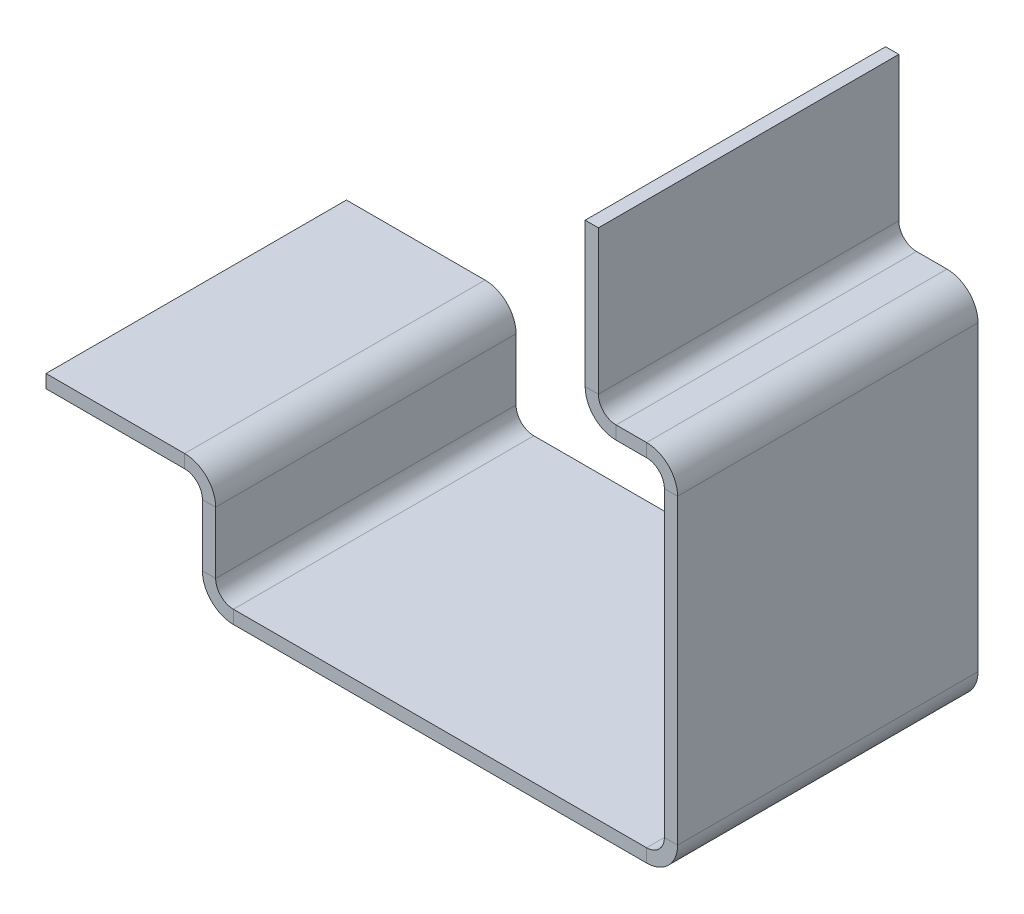
ISO-10303-21;
HEADER;
FILE_DESCRIPTION(('STEP AP214'),'2;1');
FILE_NAME('part.step','',(''),(''),'','','');
FILE_SCHEMA(('AUTOMOTIVE_DESIGN { 1 0 10303 214 1 1 1 1 }'));
ENDSEC;
DATA;
#1=APPLICATION_CONTEXT('core data for automotive mechanical design processes');
#2=APPLICATION_PROTOCOL_DEFINITION('international standard','automotive_design',2000,#1);
#3=PRODUCT_CONTEXT('',#1,'mechanical');
#4=PRODUCT('Part','Part','',(#3));
#5=PRODUCT_RELATED_PRODUCT_CATEGORY('part','',(#4));
#6=PRODUCT_DEFINITION_FORMATION('','',#4);
#7=PRODUCT_DEFINITION_CONTEXT('part definition',#1,'design');
#8=PRODUCT_DEFINITION('design','',#6,#7);
#9=PRODUCT_DEFINITION_SHAPE('','',#8);
#10=(LENGTH_UNIT() NAMED_UNIT(*) SI_UNIT(.MILLI.,.METRE.));
#11=(NAMED_UNIT(*) PLANE_ANGLE_UNIT() SI_UNIT($,.RADIAN.));
#12=(NAMED_UNIT(*) SI_UNIT($,.STERADIAN.) SOLID_ANGLE_UNIT());
#13=UNCERTAINTY_MEASURE_WITH_UNIT(LENGTH_MEASURE(1.E-05),#10,'distance_accuracy_value','');
#14=(GEOMETRIC_REPRESENTATION_CONTEXT(3) GLOBAL_UNCERTAINTY_ASSIGNED_CONTEXT((#13)) GLOBAL_UNIT_ASSIGNED_CONTEXT((#10,
#11,#12)) REPRESENTATION_CONTEXT('',''));
#15=CARTESIAN_POINT('',(0.,0.,0.));
#16=DIRECTION('',(0.,0.,1.));
#17=DIRECTION('',(1.,0.,0.));
#18=AXIS2_PLACEMENT_3D('',#15,#16,#17);
#19=CARTESIAN_POINT('',(81.4,38.12,144.15));
#20=DIRECTION('',(0.,0.,1.));
#21=DIRECTION('',(1.,0.,0.));
#22=AXIS2_PLACEMENT_3D('',#19,#20,#21);
#23=PLANE('',#22);
#24=DIRECTION('',(-1.,0.,0.));
#25=VECTOR('',#24,1.);
#26=CARTESIAN_POINT('',(81.4,38.12,144.15));
#27=LINE('',#26,#25);
#28=CARTESIAN_POINT('',(81.4,38.12,144.15));
#29=VERTEX_POINT('',#28);
#30=CARTESIAN_POINT('',(75.05,38.12,144.15));
#31=VERTEX_POINT('',#30);
#32=EDGE_CURVE('E13',#29,#31,#27,.T.);
#33=ORIENTED_EDGE('',*,*,#32,.F.);
#34=CARTESIAN_POINT('',(66.52,38.12,144.15));
#35=DIRECTION('',(0.,0.,1.));
#36=DIRECTION('',(1.,0.,0.));
#37=AXIS2_PLACEMENT_3D('',#34,#35,#36);
#38=CIRCLE('',#37,14.88);
#39=CARTESIAN_POINT('',(66.52,53.,144.15));
#40=VERTEX_POINT('',#39);
#41=EDGE_CURVE('E515',#40,#29,#38,.F.);
#42=ORIENTED_EDGE('',*,*,#41,.F.);
#43=DIRECTION('',(0.,1.,0.));
#44=VECTOR('',#43,1.);
#45=CARTESIAN_POINT('',(66.52,46.65,144.15));
#46=LINE('',#45,#44);
#47=CARTESIAN_POINT('',(66.52,46.65,144.15));
#48=VERTEX_POINT('',#47);
#49=EDGE_CURVE('E68',#48,#40,#46,.T.);
#50=ORIENTED_EDGE('',*,*,#49,.F.);
#51=CARTESIAN_POINT('',(66.52,38.12,144.15));
#52=DIRECTION('',(0.,0.,1.));
#53=DIRECTION('',(1.,0.,0.));
#54=AXIS2_PLACEMENT_3D('',#51,#52,#53);
#55=CIRCLE('',#54,8.53);
#56=EDGE_CURVE('E532',#48,#31,#55,.F.);
#57=ORIENTED_EDGE('',*,*,#56,.T.);
#58=EDGE_LOOP('',(#33,#42,#50,#57));
#59=FACE_BOUND('',#58,.T.);
#60=ADVANCED_FACE('F59',(#59),#23,.T.);
#61=CARTESIAN_POINT('',(66.52,46.65,144.15));
#62=DIRECTION('',(0.,0.,1.));
#63=DIRECTION('',(1.,0.,0.));
#64=AXIS2_PLACEMENT_3D('',#61,#62,#63);
#65=PLANE('',#64);
#66=DIRECTION('',(0.,-1.,0.));
#67=VECTOR('',#66,1.);
#68=CARTESIAN_POINT('',(81.4,53.,144.15));
#69=LINE('',#68,#67);
#70=CARTESIAN_POINT('',(81.4,8.53,144.15));
#71=VERTEX_POINT('',#70);
#72=EDGE_CURVE('E520',#29,#71,#69,.T.);
#73=ORIENTED_EDGE('',*,*,#72,.F.);
#74=ORIENTED_EDGE('',*,*,#32,.T.);
#75=DIRECTION('',(0.,1.,0.));
#76=VECTOR('',#75,1.);
#77=CARTESIAN_POINT('',(75.05,53.,144.15));
#78=LINE('',#77,#76);
#79=CARTESIAN_POINT('',(75.05,8.53,144.15));
#80=VERTEX_POINT('',#79);
#81=EDGE_CURVE('E535',#31,#80,#78,.F.);
#82=ORIENTED_EDGE('',*,*,#81,.T.);
#83=DIRECTION('',(1.,0.,0.));
#84=VECTOR('',#83,1.);
#85=CARTESIAN_POINT('',(75.05,8.53,144.15));
#86=LINE('',#85,#84);
#87=EDGE_CURVE('E484',#80,#71,#86,.T.);
#88=ORIENTED_EDGE('',*,*,#87,.T.);
#89=EDGE_LOOP('',(#73,#74,#82,#88));
#90=FACE_BOUND('',#89,.T.);
#91=ADVANCED_FACE('F632',(#90),#65,.T.);
#92=CARTESIAN_POINT('',(66.52,53.,0.));
#93=DIRECTION('',(0.,0.,-1.));
#94=DIRECTION('',(-1.,0.,0.));
#95=AXIS2_PLACEMENT_3D('',#92,#93,#94);
#96=PLANE('',#95);
#97=DIRECTION('',(0.,-1.,0.));
#98=VECTOR('',#97,1.);
#99=CARTESIAN_POINT('',(66.52,53.,0.));
#100=LINE('',#99,#98);
#101=CARTESIAN_POINT('',(66.52,53.,0.));
#102=VERTEX_POINT('',#101);
#103=CARTESIAN_POINT('',(66.52,46.65,0.));
#104=VERTEX_POINT('',#103);
#105=EDGE_CURVE('E493',#102,#104,#100,.T.);
#106=ORIENTED_EDGE('',*,*,#105,.F.);
#107=CARTESIAN_POINT('',(66.52,38.12,0.));
#108=DIRECTION('',(0.,0.,1.));
#109=DIRECTION('',(1.,0.,0.));
#110=AXIS2_PLACEMENT_3D('',#107,#108,#109);
#111=CIRCLE('',#110,14.88);
#112=CARTESIAN_POINT('',(81.4,38.12,0.));
#113=VERTEX_POINT('',#112);
#114=EDGE_CURVE('E319',#102,#113,#111,.F.);
#115=ORIENTED_EDGE('',*,*,#114,.T.);
#116=DIRECTION('',(1.,0.,0.));
#117=VECTOR('',#116,1.);
#118=CARTESIAN_POINT('',(75.05,38.12,0.));
#119=LINE('',#118,#117);
#120=CARTESIAN_POINT('',(75.05,38.12,0.));
#121=VERTEX_POINT('',#120);
#122=EDGE_CURVE('E490',#121,#113,#119,.T.);
#123=ORIENTED_EDGE('',*,*,#122,.F.);
#124=CARTESIAN_POINT('',(66.52,38.12,0.));
#125=DIRECTION('',(0.,0.,1.));
#126=DIRECTION('',(1.,0.,0.));
#127=AXIS2_PLACEMENT_3D('',#124,#125,#126);
#128=CIRCLE('',#127,8.53);
#129=EDGE_CURVE('E335',#104,#121,#128,.F.);
#130=ORIENTED_EDGE('',*,*,#129,.F.);
#131=EDGE_LOOP('',(#106,#115,#123,#130));
#132=FACE_BOUND('',#131,.T.);
#133=ADVANCED_FACE('F691',(#132),#96,.T.);
#134=CARTESIAN_POINT('',(75.05,38.12,0.));
#135=DIRECTION('',(0.,0.,-1.));
#136=DIRECTION('',(-1.,0.,0.));
#137=AXIS2_PLACEMENT_3D('',#134,#135,#136);
#138=PLANE('',#137);
#139=DIRECTION('',(1.,0.,0.));
#140=VECTOR('',#139,1.);
#141=CARTESIAN_POINT('',(81.4,53.,0.));
#142=LINE('',#141,#140);
#143=CARTESIAN_POINT('',(0.,53.,0.));
#144=VERTEX_POINT('',#143);
#145=EDGE_CURVE('E323',#144,#102,#142,.T.);
#146=ORIENTED_EDGE('',*,*,#145,.T.);
#147=ORIENTED_EDGE('',*,*,#105,.T.);
#148=DIRECTION('',(1.,0.,0.));
#149=VECTOR('',#148,1.);
#150=CARTESIAN_POINT('',(81.4,46.65,0.));
#151=LINE('',#150,#149);
#152=CARTESIAN_POINT('',(0.,46.65,0.));
#153=VERTEX_POINT('',#152);
#154=EDGE_CURVE('E331',#153,#104,#151,.T.);
#155=ORIENTED_EDGE('',*,*,#154,.F.);
#156=DIRECTION('',(0.,1.,0.));
#157=VECTOR('',#156,1.);
#158=CARTESIAN_POINT('',(0.,46.65,0.));
#159=LINE('',#158,#157);
#160=EDGE_CURVE('E327',#153,#144,#159,.T.);
#161=ORIENTED_EDGE('',*,*,#160,.T.);
#162=EDGE_LOOP('',(#146,#147,#155,#161));
#163=FACE_BOUND('',#162,.T.);
#164=ADVANCED_FACE('F695',(#163),#138,.T.);
#165=CARTESIAN_POINT('',(89.93,0.,144.15));
#166=DIRECTION('',(0.,0.,1.));
#167=DIRECTION('',(1.,0.,0.));
#168=AXIS2_PLACEMENT_3D('',#165,#166,#167);
#169=PLANE('',#168);
#170=DIRECTION('',(0.,-1.,0.));
#171=VECTOR('',#170,1.);
#172=CARTESIAN_POINT('',(89.93,0.,144.15));
#173=LINE('',#172,#171);
#174=CARTESIAN_POINT('',(89.93,0.,144.15));
#175=VERTEX_POINT('',#174);
#176=CARTESIAN_POINT('',(89.93,-6.35,144.15));
#177=VERTEX_POINT('',#176);
#178=EDGE_CURVE('E487',#175,#177,#173,.T.);
#179=ORIENTED_EDGE('',*,*,#178,.F.);
#180=CARTESIAN_POINT('',(89.93,8.53,144.15));
#181=DIRECTION('',(0.,0.,-1.));
#182=DIRECTION('',(-1.,0.,0.));
#183=AXIS2_PLACEMENT_3D('',#180,#181,#182);
#184=CIRCLE('',#183,8.53);
#185=EDGE_CURVE('E620',#71,#175,#184,.F.);
#186=ORIENTED_EDGE('',*,*,#185,.F.);
#187=ORIENTED_EDGE('',*,*,#87,.F.);
#188=CARTESIAN_POINT('',(89.93,8.53,144.15));
#189=DIRECTION('',(0.,0.,1.));
#190=DIRECTION('',(1.,0.,0.));
#191=AXIS2_PLACEMENT_3D('',#188,#189,#190);
#192=CIRCLE('',#191,14.88);
#193=EDGE_CURVE('E539',#80,#177,#192,.T.);
#194=ORIENTED_EDGE('',*,*,#193,.T.);
#195=EDGE_LOOP('',(#179,#186,#187,#194));
#196=FACE_BOUND('',#195,.T.);
#197=ADVANCED_FACE('F639',(#196),#169,.T.);
#198=CARTESIAN_POINT('',(75.05,8.53,144.15));
#199=DIRECTION('',(0.,0.,1.));
#200=DIRECTION('',(1.,0.,0.));
#201=AXIS2_PLACEMENT_3D('',#198,#199,#200);
#202=PLANE('',#201);
#203=DIRECTION('',(1.,0.,0.));
#204=VECTOR('',#203,1.);
#205=CARTESIAN_POINT('',(81.4,0.,144.15));
#206=LINE('',#205,#204);
#207=CARTESIAN_POINT('',(288.17,0.,144.15));
#208=VERTEX_POINT('',#207);
#209=EDGE_CURVE('E616',#175,#208,#206,.T.);
#210=ORIENTED_EDGE('',*,*,#209,.F.);
#211=ORIENTED_EDGE('',*,*,#178,.T.);
#212=DIRECTION('',(1.,0.,0.));
#213=VECTOR('',#212,1.);
#214=CARTESIAN_POINT('',(81.4,-6.35,144.15));
#215=LINE('',#214,#213);
#216=CARTESIAN_POINT('',(288.17,-6.35,144.15));
#217=VERTEX_POINT('',#216);
#218=EDGE_CURVE('E543',#177,#217,#215,.T.);
#219=ORIENTED_EDGE('',*,*,#218,.T.);
#220=DIRECTION('',(0.,1.,0.));
#221=VECTOR('',#220,1.);
#222=CARTESIAN_POINT('',(288.17,-6.35,144.15));
#223=LINE('',#222,#221);
#224=EDGE_CURVE('E472',#217,#208,#223,.T.);
#225=ORIENTED_EDGE('',*,*,#224,.T.);
#226=EDGE_LOOP('',(#210,#211,#219,#225));
#227=FACE_BOUND('',#226,.T.);
#228=ADVANCED_FACE('F648',(#227),#202,.T.);
#229=CARTESIAN_POINT('',(81.4,8.53,0.));
#230=DIRECTION('',(0.,0.,-1.));
#231=DIRECTION('',(-1.,0.,0.));
#232=AXIS2_PLACEMENT_3D('',#229,#230,#231);
#233=PLANE('',#232);
#234=DIRECTION('',(-1.,0.,0.));
#235=VECTOR('',#234,1.);
#236=CARTESIAN_POINT('',(81.4,8.53,0.));
#237=LINE('',#236,#235);
#238=CARTESIAN_POINT('',(81.4,8.53,0.));
#239=VERTEX_POINT('',#238);
#240=CARTESIAN_POINT('',(75.05,8.53,0.));
#241=VERTEX_POINT('',#240);
#242=EDGE_CURVE('E481',#239,#241,#237,.T.);
#243=ORIENTED_EDGE('',*,*,#242,.F.);
#244=CARTESIAN_POINT('',(89.93,8.53,0.));
#245=DIRECTION('',(0.,0.,-1.));
#246=DIRECTION('',(-1.,0.,0.));
#247=AXIS2_PLACEMENT_3D('',#244,#245,#246);
#248=CIRCLE('',#247,8.53);
#249=CARTESIAN_POINT('',(89.93,0.,0.));
#250=VERTEX_POINT('',#249);
#251=EDGE_CURVE('E311',#239,#250,#248,.F.);
#252=ORIENTED_EDGE('',*,*,#251,.T.);
#253=DIRECTION('',(0.,1.,0.));
#254=VECTOR('',#253,1.);
#255=CARTESIAN_POINT('',(89.93,-6.35,0.));
#256=LINE('',#255,#254);
#257=CARTESIAN_POINT('',(89.93,-6.35,0.));
#258=VERTEX_POINT('',#257);
#259=EDGE_CURVE('E478',#258,#250,#256,.T.);
#260=ORIENTED_EDGE('',*,*,#259,.F.);
#261=CARTESIAN_POINT('',(89.93,8.53,0.));
#262=DIRECTION('',(0.,0.,1.));
#263=DIRECTION('',(1.,0.,0.));
#264=AXIS2_PLACEMENT_3D('',#261,#262,#263);
#265=CIRCLE('',#264,14.88);
#266=EDGE_CURVE('E343',#241,#258,#265,.T.);
#267=ORIENTED_EDGE('',*,*,#266,.F.);
#268=EDGE_LOOP('',(#243,#252,#260,#267));
#269=FACE_BOUND('',#268,.T.);
#270=ADVANCED_FACE('F706',(#269),#233,.T.);
#271=CARTESIAN_POINT('',(89.93,-6.35,0.));
#272=DIRECTION('',(0.,0.,-1.));
#273=DIRECTION('',(-1.,0.,0.));
#274=AXIS2_PLACEMENT_3D('',#271,#272,#273);
#275=PLANE('',#274);
#276=DIRECTION('',(0.,-1.,0.));
#277=VECTOR('',#276,1.);
#278=CARTESIAN_POINT('',(81.4,53.,0.));
#279=LINE('',#278,#277);
#280=EDGE_CURVE('E315',#113,#239,#279,.T.);
#281=ORIENTED_EDGE('',*,*,#280,.T.);
#282=ORIENTED_EDGE('',*,*,#242,.T.);
#283=DIRECTION('',(0.,1.,0.));
#284=VECTOR('',#283,1.);
#285=CARTESIAN_POINT('',(75.05,53.,0.));
#286=LINE('',#285,#284);
#287=EDGE_CURVE('E339',#121,#241,#286,.F.);
#288=ORIENTED_EDGE('',*,*,#287,.F.);
#289=ORIENTED_EDGE('',*,*,#122,.T.);
#290=EDGE_LOOP('',(#281,#282,#288,#289));
#291=FACE_BOUND('',#290,.T.);
#292=ADVANCED_FACE('F709',(#291),#275,.T.);
#293=CARTESIAN_POINT('',(296.7,8.53,144.15));
#294=DIRECTION('',(0.,0.,1.));
#295=DIRECTION('',(1.,0.,0.));
#296=AXIS2_PLACEMENT_3D('',#293,#294,#295);
#297=PLANE('',#296);
#298=DIRECTION('',(1.,0.,0.));
#299=VECTOR('',#298,1.);
#300=CARTESIAN_POINT('',(296.7,8.53,144.15));
#301=LINE('',#300,#299);
#302=CARTESIAN_POINT('',(296.7,8.53,144.15));
#303=VERTEX_POINT('',#302);
#304=CARTESIAN_POINT('',(303.05,8.53,144.15));
#305=VERTEX_POINT('',#304);
#306=EDGE_CURVE('E475',#303,#305,#301,.T.);
#307=ORIENTED_EDGE('',*,*,#306,.F.);
#308=CARTESIAN_POINT('',(288.17,8.53,144.15));
#309=DIRECTION('',(0.,0.,-1.));
#310=DIRECTION('',(-1.,0.,0.));
#311=AXIS2_PLACEMENT_3D('',#308,#309,#310);
#312=CIRCLE('',#311,8.53);
#313=EDGE_CURVE('E612',#208,#303,#312,.F.);
#314=ORIENTED_EDGE('',*,*,#313,.F.);
#315=ORIENTED_EDGE('',*,*,#224,.F.);
#316=CARTESIAN_POINT('',(288.17,8.53,144.15));
#317=DIRECTION('',(0.,0.,1.));
#318=DIRECTION('',(1.,0.,0.));
#319=AXIS2_PLACEMENT_3D('',#316,#317,#318);
#320=CIRCLE('',#319,14.88);
#321=EDGE_CURVE('E547',#217,#305,#320,.T.);
#322=ORIENTED_EDGE('',*,*,#321,.T.);
#323=EDGE_LOOP('',(#307,#314,#315,#322));
#324=FACE_BOUND('',#323,.T.);
#325=ADVANCED_FACE('F657',(#324),#297,.T.);
#326=CARTESIAN_POINT('',(288.17,-6.35,144.15));
#327=DIRECTION('',(0.,0.,1.));
#328=DIRECTION('',(1.,0.,0.));
#329=AXIS2_PLACEMENT_3D('',#326,#327,#328);
#330=PLANE('',#329);
#331=DIRECTION('',(0.,1.,0.));
#332=VECTOR('',#331,1.);
#333=CARTESIAN_POINT('',(296.7,0.,144.15));
#334=LINE('',#333,#332);
#335=CARTESIAN_POINT('',(296.7,153.52,144.15));
#336=VERTEX_POINT('',#335);
#337=EDGE_CURVE('E608',#303,#336,#334,.T.);
#338=ORIENTED_EDGE('',*,*,#337,.F.);
#339=ORIENTED_EDGE('',*,*,#306,.T.);
#340=DIRECTION('',(0.,1.,0.));
#341=VECTOR('',#340,1.);
#342=CARTESIAN_POINT('',(303.05,0.,144.15));
#343=LINE('',#342,#341);
#344=CARTESIAN_POINT('',(303.05,153.52,144.15));
#345=VERTEX_POINT('',#344);
#346=EDGE_CURVE('E253',#305,#345,#343,.T.);
#347=ORIENTED_EDGE('',*,*,#346,.T.);
#348=DIRECTION('',(-1.,0.,0.));
#349=VECTOR('',#348,1.);
#350=CARTESIAN_POINT('',(303.05,153.52,144.15));
#351=LINE('',#350,#349);
#352=EDGE_CURVE('E243',#345,#336,#351,.T.);
#353=ORIENTED_EDGE('',*,*,#352,.T.);
#354=EDGE_LOOP('',(#338,#339,#347,#353));
#355=FACE_BOUND('',#354,.T.);
#356=ADVANCED_FACE('F555',(#355),#330,.T.);
#357=CARTESIAN_POINT('',(288.17,0.,0.));
#358=DIRECTION('',(0.,0.,-1.));
#359=DIRECTION('',(-1.,0.,0.));
#360=AXIS2_PLACEMENT_3D('',#357,#358,#359);
#361=PLANE('',#360);
#362=DIRECTION('',(0.,-1.,0.));
#363=VECTOR('',#362,1.);
#364=CARTESIAN_POINT('',(288.17,0.,0.));
#365=LINE('',#364,#363);
#366=CARTESIAN_POINT('',(288.17,0.,0.));
#367=VERTEX_POINT('',#366);
#368=CARTESIAN_POINT('',(288.17,-6.35,0.));
#369=VERTEX_POINT('',#368);
#370=EDGE_CURVE('E469',#367,#369,#365,.T.);
#371=ORIENTED_EDGE('',*,*,#370,.F.);
#372=CARTESIAN_POINT('',(288.17,8.53,0.));
#373=DIRECTION('',(0.,0.,-1.));
#374=DIRECTION('',(-1.,0.,0.));
#375=AXIS2_PLACEMENT_3D('',#372,#373,#374);
#376=CIRCLE('',#375,8.53);
#377=CARTESIAN_POINT('',(296.7,8.53,0.));
#378=VERTEX_POINT('',#377);
#379=EDGE_CURVE('E303',#367,#378,#376,.F.);
#380=ORIENTED_EDGE('',*,*,#379,.T.);
#381=DIRECTION('',(-1.,0.,0.));
#382=VECTOR('',#381,1.);
#383=CARTESIAN_POINT('',(303.05,8.53,0.));
#384=LINE('',#383,#382);
#385=CARTESIAN_POINT('',(303.05,8.53,0.));
#386=VERTEX_POINT('',#385);
#387=EDGE_CURVE('E242',#386,#378,#384,.T.);
#388=ORIENTED_EDGE('',*,*,#387,.F.);
#389=CARTESIAN_POINT('',(288.17,8.53,0.));
#390=DIRECTION('',(0.,0.,1.));
#391=DIRECTION('',(1.,0.,0.));
#392=AXIS2_PLACEMENT_3D('',#389,#390,#391);
#393=CIRCLE('',#392,14.88);
#394=EDGE_CURVE('E351',#369,#386,#393,.T.);
#395=ORIENTED_EDGE('',*,*,#394,.F.);
#396=EDGE_LOOP('',(#371,#380,#388,#395));
#397=FACE_BOUND('',#396,.T.);
#398=ADVANCED_FACE('F666',(#397),#361,.T.);
#399=CARTESIAN_POINT('',(303.05,8.53,0.));
#400=DIRECTION('',(0.,0.,-1.));
#401=DIRECTION('',(-1.,0.,0.));
#402=AXIS2_PLACEMENT_3D('',#399,#400,#401);
#403=PLANE('',#402);
#404=DIRECTION('',(1.,0.,0.));
#405=VECTOR('',#404,1.);
#406=CARTESIAN_POINT('',(81.4,0.,0.));
#407=LINE('',#406,#405);
#408=EDGE_CURVE('E307',#250,#367,#407,.T.);
#409=ORIENTED_EDGE('',*,*,#408,.T.);
#410=ORIENTED_EDGE('',*,*,#370,.T.);
#411=DIRECTION('',(1.,0.,0.));
#412=VECTOR('',#411,1.);
#413=CARTESIAN_POINT('',(81.4,-6.35,0.));
#414=LINE('',#413,#412);
#415=EDGE_CURVE('E347',#258,#369,#414,.T.);
#416=ORIENTED_EDGE('',*,*,#415,.F.);
#417=ORIENTED_EDGE('',*,*,#259,.T.);
#418=EDGE_LOOP('',(#409,#410,#416,#417));
#419=FACE_BOUND('',#418,.T.);
#420=ADVANCED_FACE('F670',(#419),#403,.T.);
#421=CARTESIAN_POINT('',(288.17,162.05,144.15));
#422=DIRECTION('',(0.,0.,1.));
#423=DIRECTION('',(1.,0.,0.));
#424=AXIS2_PLACEMENT_3D('',#421,#422,#423);
#425=PLANE('',#424);
#426=DIRECTION('',(0.,1.,0.));
#427=VECTOR('',#426,1.);
#428=CARTESIAN_POINT('',(288.17,162.05,144.15));
#429=LINE('',#428,#427);
#430=CARTESIAN_POINT('',(288.17,162.05,144.15));
#431=VERTEX_POINT('',#430);
#432=CARTESIAN_POINT('',(288.17,168.4,144.15));
#433=VERTEX_POINT('',#432);
#434=EDGE_CURVE('E229',#431,#433,#429,.T.);
#435=ORIENTED_EDGE('',*,*,#434,.F.);
#436=CARTESIAN_POINT('',(288.17,153.52,144.15));
#437=DIRECTION('',(0.,0.,-1.));
#438=DIRECTION('',(-1.,0.,0.));
#439=AXIS2_PLACEMENT_3D('',#436,#437,#438);
#440=CIRCLE('',#439,8.53);
#441=EDGE_CURVE('E567',#336,#431,#440,.F.);
#442=ORIENTED_EDGE('',*,*,#441,.F.);
#443=ORIENTED_EDGE('',*,*,#352,.F.);
#444=CARTESIAN_POINT('',(288.17,153.52,144.15));
#445=DIRECTION('',(0.,0.,1.));
#446=DIRECTION('',(1.,0.,0.));
#447=AXIS2_PLACEMENT_3D('',#444,#445,#446);
#448=CIRCLE('',#447,14.88);
#449=EDGE_CURVE('E246',#345,#433,#448,.T.);
#450=ORIENTED_EDGE('',*,*,#449,.T.);
#451=EDGE_LOOP('',(#435,#442,#443,#450));
#452=FACE_BOUND('',#451,.T.);
#453=ADVANCED_FACE('F248',(#452),#425,.T.);
#454=CARTESIAN_POINT('',(303.05,153.52,144.15));
#455=DIRECTION('',(0.,0.,1.));
#456=DIRECTION('',(1.,0.,0.));
#457=AXIS2_PLACEMENT_3D('',#454,#455,#456);
#458=PLANE('',#457);
#459=DIRECTION('',(-1.,0.,0.));
#460=VECTOR('',#459,1.);
#461=CARTESIAN_POINT('',(258.7,162.05,144.15));
#462=LINE('',#461,#460);
#463=CARTESIAN_POINT('',(273.58,162.05,144.15));
#464=VERTEX_POINT('',#463);
#465=EDGE_CURVE('E236',#431,#464,#462,.T.);
#466=ORIENTED_EDGE('',*,*,#465,.F.);
#467=ORIENTED_EDGE('',*,*,#434,.T.);
#468=DIRECTION('',(1.,0.,0.));
#469=VECTOR('',#468,1.);
#470=CARTESIAN_POINT('',(258.7,168.4,144.15));
#471=LINE('',#470,#469);
#472=CARTESIAN_POINT('',(273.58,168.4,144.15));
#473=VERTEX_POINT('',#472);
#474=EDGE_CURVE('E233',#433,#473,#471,.F.);
#475=ORIENTED_EDGE('',*,*,#474,.T.);
#476=DIRECTION('',(0.,-1.,0.));
#477=VECTOR('',#476,1.);
#478=CARTESIAN_POINT('',(273.58,168.4,144.15));
#479=LINE('',#478,#477);
#480=EDGE_CURVE('E454',#473,#464,#479,.T.);
#481=ORIENTED_EDGE('',*,*,#480,.T.);
#482=EDGE_LOOP('',(#466,#467,#475,#481));
#483=FACE_BOUND('',#482,.T.);
#484=ADVANCED_FACE('F231',(#483),#458,.T.);
#485=CARTESIAN_POINT('',(296.7,153.52,0.));
#486=DIRECTION('',(0.,0.,-1.));
#487=DIRECTION('',(-1.,0.,0.));
#488=AXIS2_PLACEMENT_3D('',#485,#486,#487);
#489=PLANE('',#488);
#490=DIRECTION('',(1.,0.,0.));
#491=VECTOR('',#490,1.);
#492=CARTESIAN_POINT('',(296.7,153.52,0.));
#493=LINE('',#492,#491);
#494=CARTESIAN_POINT('',(296.7,153.52,0.));
#495=VERTEX_POINT('',#494);
#496=CARTESIAN_POINT('',(303.05,153.52,0.));
#497=VERTEX_POINT('',#496);
#498=EDGE_CURVE('E462',#495,#497,#493,.T.);
#499=ORIENTED_EDGE('',*,*,#498,.F.);
#500=CARTESIAN_POINT('',(288.17,153.52,0.));
#501=DIRECTION('',(0.,0.,-1.));
#502=DIRECTION('',(-1.,0.,0.));
#503=AXIS2_PLACEMENT_3D('',#500,#501,#502);
#504=CIRCLE('',#503,8.53);
#505=CARTESIAN_POINT('',(288.17,162.05,0.));
#506=VERTEX_POINT('',#505);
#507=EDGE_CURVE('E295',#495,#506,#504,.F.);
#508=ORIENTED_EDGE('',*,*,#507,.T.);
#509=DIRECTION('',(0.,-1.,0.));
#510=VECTOR('',#509,1.);
#511=CARTESIAN_POINT('',(288.17,168.4,0.));
#512=LINE('',#511,#510);
#513=CARTESIAN_POINT('',(288.17,168.4,0.));
#514=VERTEX_POINT('',#513);
#515=EDGE_CURVE('E459',#514,#506,#512,.T.);
#516=ORIENTED_EDGE('',*,*,#515,.F.);
#517=CARTESIAN_POINT('',(288.17,153.52,0.));
#518=DIRECTION('',(0.,0.,1.));
#519=DIRECTION('',(1.,0.,0.));
#520=AXIS2_PLACEMENT_3D('',#517,#518,#519);
#521=CIRCLE('',#520,14.88);
#522=EDGE_CURVE('E260',#497,#514,#521,.T.);
#523=ORIENTED_EDGE('',*,*,#522,.F.);
#524=EDGE_LOOP('',(#499,#508,#516,#523));
#525=FACE_BOUND('',#524,.T.);
#526=ADVANCED_FACE('F561',(#525),#489,.T.);
#527=CARTESIAN_POINT('',(288.17,168.4,0.));
#528=DIRECTION('',(0.,0.,-1.));
#529=DIRECTION('',(-1.,0.,0.));
#530=AXIS2_PLACEMENT_3D('',#527,#528,#529);
#531=PLANE('',#530);
#532=DIRECTION('',(0.,1.,0.));
#533=VECTOR('',#532,1.);
#534=CARTESIAN_POINT('',(296.7,0.,0.));
#535=LINE('',#534,#533);
#536=EDGE_CURVE('E299',#378,#495,#535,.T.);
#537=ORIENTED_EDGE('',*,*,#536,.T.);
#538=ORIENTED_EDGE('',*,*,#498,.T.);
#539=DIRECTION('',(0.,1.,0.));
#540=VECTOR('',#539,1.);
#541=CARTESIAN_POINT('',(303.05,0.,0.));
#542=LINE('',#541,#540);
#543=EDGE_CURVE('E355',#386,#497,#542,.T.);
#544=ORIENTED_EDGE('',*,*,#543,.F.);
#545=ORIENTED_EDGE('',*,*,#387,.T.);
#546=EDGE_LOOP('',(#537,#538,#544,#545));
#547=FACE_BOUND('',#546,.T.);
#548=ADVANCED_FACE('F675',(#547),#531,.T.);
#549=CARTESIAN_POINT('',(258.7,176.93,144.15));
#550=DIRECTION('',(0.,0.,1.));
#551=DIRECTION('',(1.,0.,0.));
#552=AXIS2_PLACEMENT_3D('',#549,#550,#551);
#553=PLANE('',#552);
#554=DIRECTION('',(1.,0.,0.));
#555=VECTOR('',#554,1.);
#556=CARTESIAN_POINT('',(258.7,176.93,144.15));
#557=LINE('',#556,#555);
#558=CARTESIAN_POINT('',(258.7,176.93,144.15));
#559=VERTEX_POINT('',#558);
#560=CARTESIAN_POINT('',(265.05,176.93,144.15));
#561=VERTEX_POINT('',#560);
#562=EDGE_CURVE('E76',#559,#561,#557,.T.);
#563=ORIENTED_EDGE('',*,*,#562,.F.);
#564=CARTESIAN_POINT('',(273.58,176.93,144.15));
#565=DIRECTION('',(0.,0.,1.));
#566=DIRECTION('',(1.,0.,0.));
#567=AXIS2_PLACEMENT_3D('',#564,#565,#566);
#568=CIRCLE('',#567,14.88);
#569=EDGE_CURVE('E598',#464,#559,#568,.F.);
#570=ORIENTED_EDGE('',*,*,#569,.F.);
#571=ORIENTED_EDGE('',*,*,#480,.F.);
#572=CARTESIAN_POINT('',(273.58,176.93,144.15));
#573=DIRECTION('',(0.,0.,1.));
#574=DIRECTION('',(1.,0.,0.));
#575=AXIS2_PLACEMENT_3D('',#572,#573,#574);
#576=CIRCLE('',#575,8.53);
#577=EDGE_CURVE('E270',#473,#561,#576,.F.);
#578=ORIENTED_EDGE('',*,*,#577,.T.);
#579=EDGE_LOOP('',(#563,#570,#571,#578));
#580=FACE_BOUND('',#579,.T.);
#581=ADVANCED_FACE('F677',(#580),#553,.T.);
#582=CARTESIAN_POINT('',(273.58,168.4,144.15));
#583=DIRECTION('',(0.,0.,1.));
#584=DIRECTION('',(1.,0.,0.));
#585=AXIS2_PLACEMENT_3D('',#582,#583,#584);
#586=PLANE('',#585);
#587=DIRECTION('',(0.,1.,0.));
#588=VECTOR('',#587,1.);
#589=CARTESIAN_POINT('',(258.7,162.05,144.15));
#590=LINE('',#589,#588);
#591=CARTESIAN_POINT('',(258.7,246.05,144.15));
#592=VERTEX_POINT('',#591);
#593=EDGE_CURVE('E594',#559,#592,#590,.T.);
#594=ORIENTED_EDGE('',*,*,#593,.F.);
#595=ORIENTED_EDGE('',*,*,#562,.T.);
#596=DIRECTION('',(0.,1.,0.));
#597=VECTOR('',#596,1.);
#598=CARTESIAN_POINT('',(265.05,162.05,144.15));
#599=LINE('',#598,#597);
#600=CARTESIAN_POINT('',(265.05,246.05,144.15));
#601=VERTEX_POINT('',#600);
#602=EDGE_CURVE('E166',#561,#601,#599,.T.);
#603=ORIENTED_EDGE('',*,*,#602,.T.);
#604=DIRECTION('',(1.,0.,0.));
#605=VECTOR('',#604,1.);
#606=CARTESIAN_POINT('',(258.7,246.05,144.15));
#607=LINE('',#606,#605);
#608=EDGE_CURVE('E591',#592,#601,#607,.T.);
#609=ORIENTED_EDGE('',*,*,#608,.F.);
#610=EDGE_LOOP('',(#594,#595,#603,#609));
#611=FACE_BOUND('',#610,.T.);
#612=ADVANCED_FACE('F683',(#611),#586,.T.);
#613=CARTESIAN_POINT('',(273.58,162.05,0.));
#614=DIRECTION('',(0.,0.,-1.));
#615=DIRECTION('',(-1.,0.,0.));
#616=AXIS2_PLACEMENT_3D('',#613,#614,#615);
#617=PLANE('',#616);
#618=DIRECTION('',(0.,1.,0.));
#619=VECTOR('',#618,1.);
#620=CARTESIAN_POINT('',(273.58,162.05,0.));
#621=LINE('',#620,#619);
#622=CARTESIAN_POINT('',(273.58,162.05,0.));
#623=VERTEX_POINT('',#622);
#624=CARTESIAN_POINT('',(273.58,168.4,0.));
#625=VERTEX_POINT('',#624);
#626=EDGE_CURVE('E153',#623,#625,#621,.T.);
#627=ORIENTED_EDGE('',*,*,#626,.F.);
#628=CARTESIAN_POINT('',(273.58,176.93,0.));
#629=DIRECTION('',(0.,0.,1.));
#630=DIRECTION('',(1.,0.,0.));
#631=AXIS2_PLACEMENT_3D('',#628,#629,#630);
#632=CIRCLE('',#631,14.88);
#633=CARTESIAN_POINT('',(258.7,176.93,0.));
#634=VERTEX_POINT('',#633);
#635=EDGE_CURVE('E289',#623,#634,#632,.F.);
#636=ORIENTED_EDGE('',*,*,#635,.T.);
#637=DIRECTION('',(-1.,0.,0.));
#638=VECTOR('',#637,1.);
#639=CARTESIAN_POINT('',(265.05,176.93,0.));
#640=LINE('',#639,#638);
#641=CARTESIAN_POINT('',(265.05,176.93,0.));
#642=VERTEX_POINT('',#641);
#643=EDGE_CURVE('E160',#642,#634,#640,.T.);
#644=ORIENTED_EDGE('',*,*,#643,.F.);
#645=CARTESIAN_POINT('',(273.58,176.93,0.));
#646=DIRECTION('',(0.,0.,1.));
#647=DIRECTION('',(1.,0.,0.));
#648=AXIS2_PLACEMENT_3D('',#645,#646,#647);
#649=CIRCLE('',#648,8.53);
#650=EDGE_CURVE('E364',#625,#642,#649,.F.);
#651=ORIENTED_EDGE('',*,*,#650,.F.);
#652=EDGE_LOOP('',(#627,#636,#644,#651));
#653=FACE_BOUND('',#652,.T.);
#654=ADVANCED_FACE('F578',(#653),#617,.T.);
#655=CARTESIAN_POINT('',(265.05,176.93,0.));
#656=DIRECTION('',(0.,0.,-1.));
#657=DIRECTION('',(-1.,0.,0.));
#658=AXIS2_PLACEMENT_3D('',#655,#656,#657);
#659=PLANE('',#658);
#660=DIRECTION('',(-1.,0.,0.));
#661=VECTOR('',#660,1.);
#662=CARTESIAN_POINT('',(258.7,162.05,0.));
#663=LINE('',#662,#661);
#664=EDGE_CURVE('E292',#506,#623,#663,.T.);
#665=ORIENTED_EDGE('',*,*,#664,.T.);
#666=ORIENTED_EDGE('',*,*,#626,.T.);
#667=DIRECTION('',(1.,0.,0.));
#668=VECTOR('',#667,1.);
#669=CARTESIAN_POINT('',(258.7,168.4,0.));
#670=LINE('',#669,#668);
#671=EDGE_CURVE('E361',#514,#625,#670,.F.);
#672=ORIENTED_EDGE('',*,*,#671,.F.);
#673=ORIENTED_EDGE('',*,*,#515,.T.);
#674=EDGE_LOOP('',(#665,#666,#672,#673));
#675=FACE_BOUND('',#674,.T.);
#676=ADVANCED_FACE('F563',(#675),#659,.T.);
#677=CARTESIAN_POINT('',(265.05,162.05,144.15));
#678=DIRECTION('',(-1.,0.,0.));
#679=DIRECTION('',(0.,0.,1.));
#680=AXIS2_PLACEMENT_3D('',#677,#678,#679);
#681=PLANE('',#680);
#682=DIRECTION('',(0.,1.,0.));
#683=VECTOR('',#682,1.);
#684=CARTESIAN_POINT('',(265.05,162.05,0.));
#685=LINE('',#684,#683);
#686=CARTESIAN_POINT('',(265.05,246.05,0.));
#687=VERTEX_POINT('',#686);
#688=EDGE_CURVE('E277',#642,#687,#685,.T.);
#689=ORIENTED_EDGE('',*,*,#688,.T.);
#690=DIRECTION('',(0.,0.,-1.));
#691=VECTOR('',#690,1.);
#692=CARTESIAN_POINT('',(265.05,246.05,144.15));
#693=LINE('',#692,#691);
#694=EDGE_CURVE('E447',#601,#687,#693,.T.);
#695=ORIENTED_EDGE('',*,*,#694,.F.);
#696=ORIENTED_EDGE('',*,*,#602,.F.);
#697=DIRECTION('',(0.,0.,-1.));
#698=VECTOR('',#697,1.);
#699=CARTESIAN_POINT('',(265.05,176.93,144.15));
#700=LINE('',#699,#698);
#701=EDGE_CURVE('E273',#561,#642,#700,.T.);
#702=ORIENTED_EDGE('',*,*,#701,.T.);
#703=EDGE_LOOP('',(#689,#695,#696,#702));
#704=FACE_BOUND('',#703,.T.);
#705=ADVANCED_FACE('F584',(#704),#681,.F.);
#706=CARTESIAN_POINT('',(258.7,246.05,144.15));
#707=DIRECTION('',(0.,1.,0.));
#708=DIRECTION('',(0.,0.,1.));
#709=AXIS2_PLACEMENT_3D('',#706,#707,#708);
#710=PLANE('',#709);
#711=DIRECTION('',(1.,0.,0.));
#712=VECTOR('',#711,1.);
#713=CARTESIAN_POINT('',(258.7,246.05,0.));
#714=LINE('',#713,#712);
#715=CARTESIAN_POINT('',(258.7,246.05,0.));
#716=VERTEX_POINT('',#715);
#717=EDGE_CURVE('E281',#716,#687,#714,.T.);
#718=ORIENTED_EDGE('',*,*,#717,.F.);
#719=DIRECTION('',(0.,0.,-1.));
#720=VECTOR('',#719,1.);
#721=CARTESIAN_POINT('',(258.7,246.05,144.15));
#722=LINE('',#721,#720);
#723=EDGE_CURVE('E444',#592,#716,#722,.T.);
#724=ORIENTED_EDGE('',*,*,#723,.F.);
#725=ORIENTED_EDGE('',*,*,#608,.T.);
#726=ORIENTED_EDGE('',*,*,#694,.T.);
#727=EDGE_LOOP('',(#718,#724,#725,#726));
#728=FACE_BOUND('',#727,.T.);
#729=ADVANCED_FACE('F589',(#728),#710,.T.);
#730=CARTESIAN_POINT('',(258.7,162.05,144.15));
#731=DIRECTION('',(-1.,0.,0.));
#732=DIRECTION('',(0.,0.,1.));
#733=AXIS2_PLACEMENT_3D('',#730,#731,#732);
#734=PLANE('',#733);
#735=DIRECTION('',(0.,1.,0.));
#736=VECTOR('',#735,1.);
#737=CARTESIAN_POINT('',(258.7,162.05,0.));
#738=LINE('',#737,#736);
#739=EDGE_CURVE('E285',#634,#716,#738,.T.);
#740=ORIENTED_EDGE('',*,*,#739,.F.);
#741=DIRECTION('',(0.,0.,-1.));
#742=VECTOR('',#741,1.);
#743=CARTESIAN_POINT('',(258.7,176.93,144.15));
#744=LINE('',#743,#742);
#745=EDGE_CURVE('E440',#559,#634,#744,.T.);
#746=ORIENTED_EDGE('',*,*,#745,.F.);
#747=ORIENTED_EDGE('',*,*,#593,.T.);
#748=ORIENTED_EDGE('',*,*,#723,.T.);
#749=EDGE_LOOP('',(#740,#746,#747,#748));
#750=FACE_BOUND('',#749,.T.);
#751=ADVANCED_FACE('F791',(#750),#734,.T.);
#752=CARTESIAN_POINT('',(273.58,176.93,144.15));
#753=DIRECTION('',(0.,0.,-1.));
#754=DIRECTION('',(-1.,0.,0.));
#755=AXIS2_PLACEMENT_3D('',#752,#753,#754);
#756=CYLINDRICAL_SURFACE('',#755,14.88);
#757=ORIENTED_EDGE('',*,*,#635,.F.);
#758=DIRECTION('',(0.,0.,-1.));
#759=VECTOR('',#758,1.);
#760=CARTESIAN_POINT('',(273.58,162.05,144.15));
#761=LINE('',#760,#759);
#762=EDGE_CURVE('E436',#464,#623,#761,.T.);
#763=ORIENTED_EDGE('',*,*,#762,.F.);
#764=ORIENTED_EDGE('',*,*,#569,.T.);
#765=ORIENTED_EDGE('',*,*,#745,.T.);
#766=EDGE_LOOP('',(#757,#763,#764,#765));
#767=FACE_BOUND('',#766,.T.);
#768=ADVANCED_FACE('F575',(#767),#756,.T.);
#769=CARTESIAN_POINT('',(258.7,162.05,144.15));
#770=DIRECTION('',(0.,-1.,0.));
#771=DIRECTION('',(0.,0.,-1.));
#772=AXIS2_PLACEMENT_3D('',#769,#770,#771);
#773=PLANE('',#772);
#774=ORIENTED_EDGE('',*,*,#664,.F.);
#775=DIRECTION('',(0.,0.,-1.));
#776=VECTOR('',#775,1.);
#777=CARTESIAN_POINT('',(288.17,162.05,144.15));
#778=LINE('',#777,#776);
#779=EDGE_CURVE('E432',#431,#506,#778,.T.);
#780=ORIENTED_EDGE('',*,*,#779,.F.);
#781=ORIENTED_EDGE('',*,*,#465,.T.);
#782=ORIENTED_EDGE('',*,*,#762,.T.);
#783=EDGE_LOOP('',(#774,#780,#781,#782));
#784=FACE_BOUND('',#783,.T.);
#785=ADVANCED_FACE('F569',(#784),#773,.T.);
#786=CARTESIAN_POINT('',(288.17,153.52,144.15));
#787=DIRECTION('',(0.,0.,-1.));
#788=DIRECTION('',(-1.,0.,0.));
#789=AXIS2_PLACEMENT_3D('',#786,#787,#788);
#790=CYLINDRICAL_SURFACE('',#789,8.53);
#791=ORIENTED_EDGE('',*,*,#507,.F.);
#792=DIRECTION('',(0.,0.,-1.));
#793=VECTOR('',#792,1.);
#794=CARTESIAN_POINT('',(296.7,153.52,144.15));
#795=LINE('',#794,#793);
#796=EDGE_CURVE('E428',#336,#495,#795,.T.);
#797=ORIENTED_EDGE('',*,*,#796,.F.);
#798=ORIENTED_EDGE('',*,*,#441,.T.);
#799=ORIENTED_EDGE('',*,*,#779,.T.);
#800=EDGE_LOOP('',(#791,#797,#798,#799));
#801=FACE_BOUND('',#800,.T.);
#802=ADVANCED_FACE('F566',(#801),#790,.F.);
#803=CARTESIAN_POINT('',(296.7,0.,144.15));
#804=DIRECTION('',(-1.,0.,0.));
#805=DIRECTION('',(0.,0.,1.));
#806=AXIS2_PLACEMENT_3D('',#803,#804,#805);
#807=PLANE('',#806);
#808=ORIENTED_EDGE('',*,*,#536,.F.);
#809=DIRECTION('',(0.,0.,-1.));
#810=VECTOR('',#809,1.);
#811=CARTESIAN_POINT('',(296.7,8.53,144.15));
#812=LINE('',#811,#810);
#813=EDGE_CURVE('E424',#303,#378,#812,.T.);
#814=ORIENTED_EDGE('',*,*,#813,.F.);
#815=ORIENTED_EDGE('',*,*,#337,.T.);
#816=ORIENTED_EDGE('',*,*,#796,.T.);
#817=EDGE_LOOP('',(#808,#814,#815,#816));
#818=FACE_BOUND('',#817,.T.);
#819=ADVANCED_FACE('F663',(#818),#807,.T.);
#820=CARTESIAN_POINT('',(288.17,8.53,144.15));
#821=DIRECTION('',(0.,0.,-1.));
#822=DIRECTION('',(-1.,0.,0.));
#823=AXIS2_PLACEMENT_3D('',#820,#821,#822);
#824=CYLINDRICAL_SURFACE('',#823,8.53);
#825=ORIENTED_EDGE('',*,*,#379,.F.);
#826=DIRECTION('',(0.,0.,-1.));
#827=VECTOR('',#826,1.);
#828=CARTESIAN_POINT('',(288.17,0.,144.15));
#829=LINE('',#828,#827);
#830=EDGE_CURVE('E420',#208,#367,#829,.T.);
#831=ORIENTED_EDGE('',*,*,#830,.F.);
#832=ORIENTED_EDGE('',*,*,#313,.T.);
#833=ORIENTED_EDGE('',*,*,#813,.T.);
#834=EDGE_LOOP('',(#825,#831,#832,#833));
#835=FACE_BOUND('',#834,.T.);
#836=ADVANCED_FACE('F656',(#835),#824,.F.);
#837=CARTESIAN_POINT('',(81.4,0.,144.15));
#838=DIRECTION('',(0.,1.,0.));
#839=DIRECTION('',(-1.,0.,0.));
#840=AXIS2_PLACEMENT_3D('',#837,#838,#839);
#841=PLANE('',#840);
#842=ORIENTED_EDGE('',*,*,#408,.F.);
#843=DIRECTION('',(0.,0.,-1.));
#844=VECTOR('',#843,1.);
#845=CARTESIAN_POINT('',(89.93,0.,144.15));
#846=LINE('',#845,#844);
#847=EDGE_CURVE('E416',#175,#250,#846,.T.);
#848=ORIENTED_EDGE('',*,*,#847,.F.);
#849=ORIENTED_EDGE('',*,*,#209,.T.);
#850=ORIENTED_EDGE('',*,*,#830,.T.);
#851=EDGE_LOOP('',(#842,#848,#849,#850));
#852=FACE_BOUND('',#851,.T.);
#853=ADVANCED_FACE('F647',(#852),#841,.T.);
#854=CARTESIAN_POINT('',(89.93,8.53,144.15));
#855=DIRECTION('',(0.,0.,-1.));
#856=DIRECTION('',(-1.,0.,0.));
#857=AXIS2_PLACEMENT_3D('',#854,#855,#856);
#858=CYLINDRICAL_SURFACE('',#857,8.53);
#859=ORIENTED_EDGE('',*,*,#251,.F.);
#860=DIRECTION('',(0.,0.,-1.));
#861=VECTOR('',#860,1.);
#862=CARTESIAN_POINT('',(81.4,8.53,144.15));
#863=LINE('',#862,#861);
#864=EDGE_CURVE('E412',#71,#239,#863,.T.);
#865=ORIENTED_EDGE('',*,*,#864,.F.);
#866=ORIENTED_EDGE('',*,*,#185,.T.);
#867=ORIENTED_EDGE('',*,*,#847,.T.);
#868=EDGE_LOOP('',(#859,#865,#866,#867));
#869=FACE_BOUND('',#868,.T.);
#870=ADVANCED_FACE('F638',(#869),#858,.F.);
#871=CARTESIAN_POINT('',(81.4,53.,144.15));
#872=DIRECTION('',(1.,0.,0.));
#873=DIRECTION('',(0.,0.,-1.));
#874=AXIS2_PLACEMENT_3D('',#871,#872,#873);
#875=PLANE('',#874);
#876=ORIENTED_EDGE('',*,*,#280,.F.);
#877=DIRECTION('',(0.,0.,-1.));
#878=VECTOR('',#877,1.);
#879=CARTESIAN_POINT('',(81.4,38.12,144.15));
#880=LINE('',#879,#878);
#881=EDGE_CURVE('E408',#29,#113,#880,.T.);
#882=ORIENTED_EDGE('',*,*,#881,.F.);
#883=ORIENTED_EDGE('',*,*,#72,.T.);
#884=ORIENTED_EDGE('',*,*,#864,.T.);
#885=EDGE_LOOP('',(#876,#882,#883,#884));
#886=FACE_BOUND('',#885,.T.);
#887=ADVANCED_FACE('F628',(#886),#875,.T.);
#888=CARTESIAN_POINT('',(66.52,38.12,144.15));
#889=DIRECTION('',(0.,0.,-1.));
#890=DIRECTION('',(-1.,0.,0.));
#891=AXIS2_PLACEMENT_3D('',#888,#889,#890);
#892=CYLINDRICAL_SURFACE('',#891,14.88);
#893=ORIENTED_EDGE('',*,*,#114,.F.);
#894=DIRECTION('',(0.,0.,-1.));
#895=VECTOR('',#894,1.);
#896=CARTESIAN_POINT('',(66.52,53.,144.15));
#897=LINE('',#896,#895);
#898=EDGE_CURVE('E404',#40,#102,#897,.T.);
#899=ORIENTED_EDGE('',*,*,#898,.F.);
#900=ORIENTED_EDGE('',*,*,#41,.T.);
#901=ORIENTED_EDGE('',*,*,#881,.T.);
#902=EDGE_LOOP('',(#893,#899,#900,#901));
#903=FACE_BOUND('',#902,.T.);
#904=ADVANCED_FACE('F514',(#903),#892,.T.);
#905=CARTESIAN_POINT('',(81.4,53.,144.15));
#906=DIRECTION('',(0.,1.,0.));
#907=DIRECTION('',(-1.,0.,0.));
#908=AXIS2_PLACEMENT_3D('',#905,#906,#907);
#909=PLANE('',#908);
#910=ORIENTED_EDGE('',*,*,#145,.F.);
#911=DIRECTION('',(0.,0.,-1.));
#912=VECTOR('',#911,1.);
#913=CARTESIAN_POINT('',(0.,53.,144.15));
#914=LINE('',#913,#912);
#915=CARTESIAN_POINT('',(0.,53.,144.15));
#916=VERTEX_POINT('',#915);
#917=EDGE_CURVE('E401',#916,#144,#914,.T.);
#918=ORIENTED_EDGE('',*,*,#917,.F.);
#919=DIRECTION('',(1.,0.,0.));
#920=VECTOR('',#919,1.);
#921=CARTESIAN_POINT('',(81.4,53.,144.15));
#922=LINE('',#921,#920);
#923=EDGE_CURVE('E503',#916,#40,#922,.T.);
#924=ORIENTED_EDGE('',*,*,#923,.T.);
#925=ORIENTED_EDGE('',*,*,#898,.T.);
#926=EDGE_LOOP('',(#910,#918,#924,#925));
#927=FACE_BOUND('',#926,.T.);
#928=ADVANCED_FACE('F522',(#927),#909,.T.);
#929=CARTESIAN_POINT('',(0.,46.65,144.15));
#930=DIRECTION('',(-1.,0.,0.));
#931=DIRECTION('',(0.,0.,1.));
#932=AXIS2_PLACEMENT_3D('',#929,#930,#931);
#933=PLANE('',#932);
#934=ORIENTED_EDGE('',*,*,#160,.F.);
#935=DIRECTION('',(0.,0.,-1.));
#936=VECTOR('',#935,1.);
#937=CARTESIAN_POINT('',(0.,46.65,144.15));
#938=LINE('',#937,#936);
#939=CARTESIAN_POINT('',(0.,46.65,144.15));
#940=VERTEX_POINT('',#939);
#941=EDGE_CURVE('E398',#940,#153,#938,.T.);
#942=ORIENTED_EDGE('',*,*,#941,.F.);
#943=DIRECTION('',(0.,1.,0.));
#944=VECTOR('',#943,1.);
#945=CARTESIAN_POINT('',(0.,46.65,144.15));
#946=LINE('',#945,#944);
#947=EDGE_CURVE('E524',#940,#916,#946,.T.);
#948=ORIENTED_EDGE('',*,*,#947,.T.);
#949=ORIENTED_EDGE('',*,*,#917,.T.);
#950=EDGE_LOOP('',(#934,#942,#948,#949));
#951=FACE_BOUND('',#950,.T.);
#952=ADVANCED_FACE('F892',(#951),#933,.T.);
#953=CARTESIAN_POINT('',(81.4,46.65,144.15));
#954=DIRECTION('',(0.,1.,0.));
#955=DIRECTION('',(-1.,0.,0.));
#956=AXIS2_PLACEMENT_3D('',#953,#954,#955);
#957=PLANE('',#956);
#958=ORIENTED_EDGE('',*,*,#154,.T.);
#959=DIRECTION('',(0.,0.,-1.));
#960=VECTOR('',#959,1.);
#961=CARTESIAN_POINT('',(66.52,46.65,144.15));
#962=LINE('',#961,#960);
#963=EDGE_CURVE('E394',#48,#104,#962,.T.);
#964=ORIENTED_EDGE('',*,*,#963,.F.);
#965=DIRECTION('',(1.,0.,0.));
#966=VECTOR('',#965,1.);
#967=CARTESIAN_POINT('',(81.4,46.65,144.15));
#968=LINE('',#967,#966);
#969=EDGE_CURVE('E506',#940,#48,#968,.T.);
#970=ORIENTED_EDGE('',*,*,#969,.F.);
#971=ORIENTED_EDGE('',*,*,#941,.T.);
#972=EDGE_LOOP('',(#958,#964,#970,#971));
#973=FACE_BOUND('',#972,.T.);
#974=ADVANCED_FACE('F902',(#973),#957,.F.);
#975=CARTESIAN_POINT('',(66.52,38.12,144.15));
#976=DIRECTION('',(0.,0.,-1.));
#977=DIRECTION('',(-1.,0.,0.));
#978=AXIS2_PLACEMENT_3D('',#975,#976,#977);
#979=CYLINDRICAL_SURFACE('',#978,8.53);
#980=ORIENTED_EDGE('',*,*,#129,.T.);
#981=DIRECTION('',(0.,0.,-1.));
#982=VECTOR('',#981,1.);
#983=CARTESIAN_POINT('',(75.05,38.12,144.15));
#984=LINE('',#983,#982);
#985=EDGE_CURVE('E390',#31,#121,#984,.T.);
#986=ORIENTED_EDGE('',*,*,#985,.F.);
#987=ORIENTED_EDGE('',*,*,#56,.F.);
#988=ORIENTED_EDGE('',*,*,#963,.T.);
#989=EDGE_LOOP('',(#980,#986,#987,#988));
#990=FACE_BOUND('',#989,.T.);
#991=ADVANCED_FACE('F913',(#990),#979,.F.);
#992=CARTESIAN_POINT('',(75.05,53.,144.15));
#993=DIRECTION('',(1.,0.,0.));
#994=DIRECTION('',(0.,0.,-1.));
#995=AXIS2_PLACEMENT_3D('',#992,#993,#994);
#996=PLANE('',#995);
#997=ORIENTED_EDGE('',*,*,#287,.T.);
#998=DIRECTION('',(0.,0.,-1.));
#999=VECTOR('',#998,1.);
#1000=CARTESIAN_POINT('',(75.05,8.53,144.15));
#1001=LINE('',#1000,#999);
#1002=EDGE_CURVE('E386',#80,#241,#1001,.T.);
#1003=ORIENTED_EDGE('',*,*,#1002,.F.);
#1004=ORIENTED_EDGE('',*,*,#81,.F.);
#1005=ORIENTED_EDGE('',*,*,#985,.T.);
#1006=EDGE_LOOP('',(#997,#1003,#1004,#1005));
#1007=FACE_BOUND('',#1006,.T.);
#1008=ADVANCED_FACE('F924',(#1007),#996,.F.);
#1009=CARTESIAN_POINT('',(89.93,8.53,144.15));
#1010=DIRECTION('',(0.,0.,-1.));
#1011=DIRECTION('',(-1.,0.,0.));
#1012=AXIS2_PLACEMENT_3D('',#1009,#1010,#1011);
#1013=CYLINDRICAL_SURFACE('',#1012,14.88);
#1014=ORIENTED_EDGE('',*,*,#266,.T.);
#1015=DIRECTION('',(0.,0.,-1.));
#1016=VECTOR('',#1015,1.);
#1017=CARTESIAN_POINT('',(89.93,-6.35,144.15));
#1018=LINE('',#1017,#1016);
#1019=EDGE_CURVE('E382',#177,#258,#1018,.T.);
#1020=ORIENTED_EDGE('',*,*,#1019,.F.);
#1021=ORIENTED_EDGE('',*,*,#193,.F.);
#1022=ORIENTED_EDGE('',*,*,#1002,.T.);
#1023=EDGE_LOOP('',(#1014,#1020,#1021,#1022));
#1024=FACE_BOUND('',#1023,.T.);
#1025=ADVANCED_FACE('F935',(#1024),#1013,.T.);
#1026=CARTESIAN_POINT('',(81.4,-6.35,144.15));
#1027=DIRECTION('',(0.,1.,0.));
#1028=DIRECTION('',(-1.,0.,0.));
#1029=AXIS2_PLACEMENT_3D('',#1026,#1027,#1028);
#1030=PLANE('',#1029);
#1031=ORIENTED_EDGE('',*,*,#415,.T.);
#1032=DIRECTION('',(0.,0.,-1.));
#1033=VECTOR('',#1032,1.);
#1034=CARTESIAN_POINT('',(288.17,-6.35,144.15));
#1035=LINE('',#1034,#1033);
#1036=EDGE_CURVE('E378',#217,#369,#1035,.T.);
#1037=ORIENTED_EDGE('',*,*,#1036,.F.);
#1038=ORIENTED_EDGE('',*,*,#218,.F.);
#1039=ORIENTED_EDGE('',*,*,#1019,.T.);
#1040=EDGE_LOOP('',(#1031,#1037,#1038,#1039));
#1041=FACE_BOUND('',#1040,.T.);
#1042=ADVANCED_FACE('F672',(#1041),#1030,.F.);
#1043=CARTESIAN_POINT('',(288.17,8.53,144.15));
#1044=DIRECTION('',(0.,0.,-1.));
#1045=DIRECTION('',(-1.,0.,0.));
#1046=AXIS2_PLACEMENT_3D('',#1043,#1044,#1045);
#1047=CYLINDRICAL_SURFACE('',#1046,14.88);
#1048=ORIENTED_EDGE('',*,*,#394,.T.);
#1049=DIRECTION('',(0.,0.,-1.));
#1050=VECTOR('',#1049,1.);
#1051=CARTESIAN_POINT('',(303.05,8.53,144.15));
#1052=LINE('',#1051,#1050);
#1053=EDGE_CURVE('E374',#305,#386,#1052,.T.);
#1054=ORIENTED_EDGE('',*,*,#1053,.F.);
#1055=ORIENTED_EDGE('',*,*,#321,.F.);
#1056=ORIENTED_EDGE('',*,*,#1036,.T.);
#1057=EDGE_LOOP('',(#1048,#1054,#1055,#1056));
#1058=FACE_BOUND('',#1057,.T.);
#1059=ADVANCED_FACE('F674',(#1058),#1047,.T.);
#1060=CARTESIAN_POINT('',(303.05,0.,144.15));
#1061=DIRECTION('',(-1.,0.,0.));
#1062=DIRECTION('',(0.,0.,1.));
#1063=AXIS2_PLACEMENT_3D('',#1060,#1061,#1062);
#1064=PLANE('',#1063);
#1065=ORIENTED_EDGE('',*,*,#543,.T.);
#1066=DIRECTION('',(0.,0.,-1.));
#1067=VECTOR('',#1066,1.);
#1068=CARTESIAN_POINT('',(303.05,153.52,144.15));
#1069=LINE('',#1068,#1067);
#1070=EDGE_CURVE('E263',#345,#497,#1069,.T.);
#1071=ORIENTED_EDGE('',*,*,#1070,.F.);
#1072=ORIENTED_EDGE('',*,*,#346,.F.);
#1073=ORIENTED_EDGE('',*,*,#1053,.T.);
#1074=EDGE_LOOP('',(#1065,#1071,#1072,#1073));
#1075=FACE_BOUND('',#1074,.T.);
#1076=ADVANCED_FACE('F558',(#1075),#1064,.F.);
#1077=CARTESIAN_POINT('',(288.17,153.52,144.15));
#1078=DIRECTION('',(0.,0.,-1.));
#1079=DIRECTION('',(-1.,0.,0.));
#1080=AXIS2_PLACEMENT_3D('',#1077,#1078,#1079);
#1081=CYLINDRICAL_SURFACE('',#1080,14.88);
#1082=ORIENTED_EDGE('',*,*,#522,.T.);
#1083=DIRECTION('',(0.,0.,-1.));
#1084=VECTOR('',#1083,1.);
#1085=CARTESIAN_POINT('',(288.17,168.4,144.15));
#1086=LINE('',#1085,#1084);
#1087=EDGE_CURVE('E257',#433,#514,#1086,.T.);
#1088=ORIENTED_EDGE('',*,*,#1087,.F.);
#1089=ORIENTED_EDGE('',*,*,#449,.F.);
#1090=ORIENTED_EDGE('',*,*,#1070,.T.);
#1091=EDGE_LOOP('',(#1082,#1088,#1089,#1090));
#1092=FACE_BOUND('',#1091,.T.);
#1093=ADVANCED_FACE('F258',(#1092),#1081,.T.);
#1094=CARTESIAN_POINT('',(258.7,168.4,144.15));
#1095=DIRECTION('',(0.,-1.,0.));
#1096=DIRECTION('',(0.,0.,-1.));
#1097=AXIS2_PLACEMENT_3D('',#1094,#1095,#1096);
#1098=PLANE('',#1097);
#1099=ORIENTED_EDGE('',*,*,#671,.T.);
#1100=DIRECTION('',(0.,0.,-1.));
#1101=VECTOR('',#1100,1.);
#1102=CARTESIAN_POINT('',(273.58,168.4,144.15));
#1103=LINE('',#1102,#1101);
#1104=EDGE_CURVE('E264',#473,#625,#1103,.T.);
#1105=ORIENTED_EDGE('',*,*,#1104,.F.);
#1106=ORIENTED_EDGE('',*,*,#474,.F.);
#1107=ORIENTED_EDGE('',*,*,#1087,.T.);
#1108=EDGE_LOOP('',(#1099,#1105,#1106,#1107));
#1109=FACE_BOUND('',#1108,.T.);
#1110=ADVANCED_FACE('F266',(#1109),#1098,.F.);
#1111=CARTESIAN_POINT('',(273.58,176.93,144.15));
#1112=DIRECTION('',(0.,0.,-1.));
#1113=DIRECTION('',(-1.,0.,0.));
#1114=AXIS2_PLACEMENT_3D('',#1111,#1112,#1113);
#1115=CYLINDRICAL_SURFACE('',#1114,8.53);
#1116=ORIENTED_EDGE('',*,*,#650,.T.);
#1117=ORIENTED_EDGE('',*,*,#701,.F.);
#1118=ORIENTED_EDGE('',*,*,#577,.F.);
#1119=ORIENTED_EDGE('',*,*,#1104,.T.);
#1120=EDGE_LOOP('',(#1116,#1117,#1118,#1119));
#1121=FACE_BOUND('',#1120,.T.);
#1122=ADVANCED_FACE('F581',(#1121),#1115,.F.);
#1123=CARTESIAN_POINT('',(273.58,176.93,144.15));
#1124=DIRECTION('',(0.,0.,1.));
#1125=DIRECTION('',(1.,0.,0.));
#1126=AXIS2_PLACEMENT_3D('',#1123,#1124,#1125);
#1127=PLANE('',#1126);
#1128=ORIENTED_EDGE('',*,*,#969,.T.);
#1129=ORIENTED_EDGE('',*,*,#49,.T.);
#1130=ORIENTED_EDGE('',*,*,#923,.F.);
#1131=ORIENTED_EDGE('',*,*,#947,.F.);
#1132=EDGE_LOOP('',(#1128,#1129,#1130,#1131));
#1133=FACE_BOUND('',#1132,.T.);
#1134=ADVANCED_FACE('F500',(#1133),#1127,.T.);
#1135=CARTESIAN_POINT('',(273.58,176.93,0.));
#1136=DIRECTION('',(0.,0.,1.));
#1137=DIRECTION('',(1.,0.,0.));
#1138=AXIS2_PLACEMENT_3D('',#1135,#1136,#1137);
#1139=PLANE('',#1138);
#1140=ORIENTED_EDGE('',*,*,#688,.F.);
#1141=ORIENTED_EDGE('',*,*,#643,.T.);
#1142=ORIENTED_EDGE('',*,*,#739,.T.);
#1143=ORIENTED_EDGE('',*,*,#717,.T.);
#1144=EDGE_LOOP('',(#1140,#1141,#1142,#1143));
#1145=FACE_BOUND('',#1144,.T.);
#1146=ADVANCED_FACE('F586',(#1145),#1139,.F.);
#1147=CLOSED_SHELL('',(#60,#91,#133,#164,#197,#228,#270,#292,#325,#356,#398,#420,#453,#484,#526,
#548,#581,#612,#654,#676,#705,#729,#751,#768,#785,#802,#819,#836,#853,#870,#887,#904,#928,#952,
#974,#991,#1008,#1025,#1042,#1059,#1076,#1093,#1110,#1122,#1134,#1146));
#1148=MANIFOLD_SOLID_BREP('B2',#1147);
#1149=ADVANCED_BREP_SHAPE_REPRESENTATION('',(#18,#1148),#14);
#1150=SHAPE_DEFINITION_REPRESENTATION(#9,#1149);
ENDSEC;
END-ISO-10303-21;
